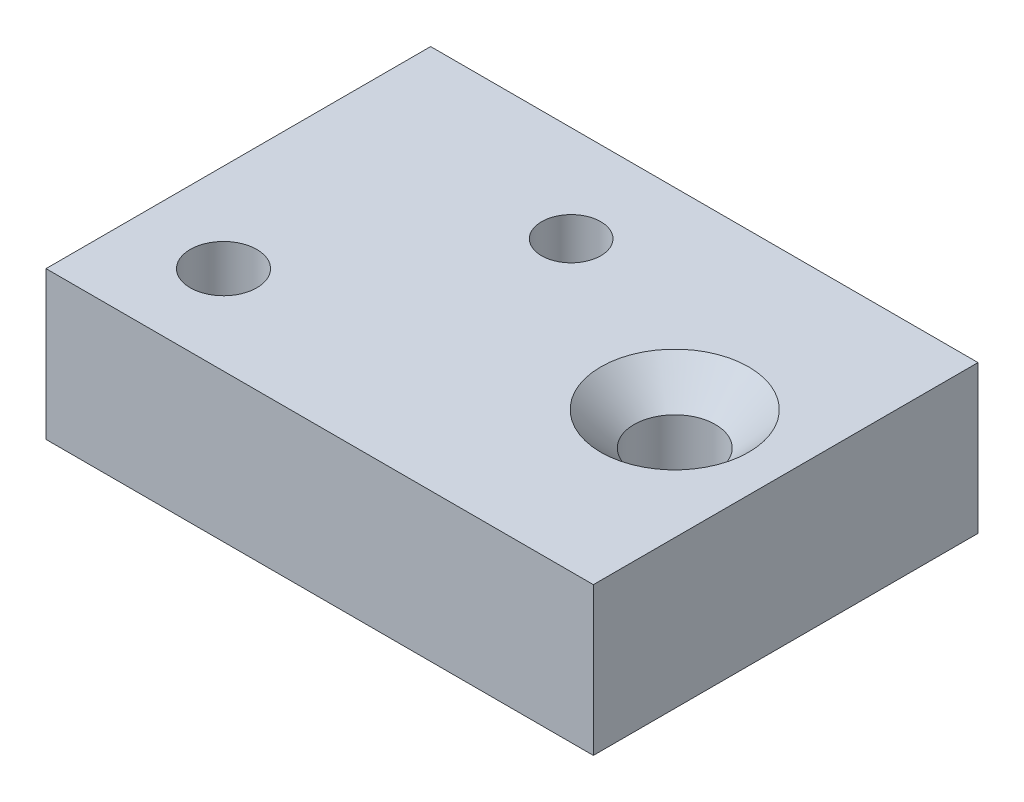
ISO-10303-21;
HEADER;
FILE_DESCRIPTION(('STEP AP214'),'2;1');
FILE_NAME('part.step','',(''),(''),'','','');
FILE_SCHEMA(('AUTOMOTIVE_DESIGN { 1 0 10303 214 1 1 1 1 }'));
ENDSEC;
DATA;
#1=APPLICATION_CONTEXT('core data for automotive mechanical design processes');
#2=APPLICATION_PROTOCOL_DEFINITION('international standard','automotive_design',2000,#1);
#3=PRODUCT_CONTEXT('',#1,'mechanical');
#4=PRODUCT('Part','Part','',(#3));
#5=PRODUCT_RELATED_PRODUCT_CATEGORY('part','',(#4));
#6=PRODUCT_DEFINITION_FORMATION('','',#4);
#7=PRODUCT_DEFINITION_CONTEXT('part definition',#1,'design');
#8=PRODUCT_DEFINITION('design','',#6,#7);
#9=PRODUCT_DEFINITION_SHAPE('','',#8);
#10=(LENGTH_UNIT() NAMED_UNIT(*) SI_UNIT(.MILLI.,.METRE.));
#11=(NAMED_UNIT(*) PLANE_ANGLE_UNIT() SI_UNIT($,.RADIAN.));
#12=(NAMED_UNIT(*) SI_UNIT($,.STERADIAN.) SOLID_ANGLE_UNIT());
#13=UNCERTAINTY_MEASURE_WITH_UNIT(LENGTH_MEASURE(1.E-05),#10,'distance_accuracy_value','');
#14=(GEOMETRIC_REPRESENTATION_CONTEXT(3) GLOBAL_UNCERTAINTY_ASSIGNED_CONTEXT((#13)) GLOBAL_UNIT_ASSIGNED_CONTEXT((#10,
#11,#12)) REPRESENTATION_CONTEXT('',''));
#15=CARTESIAN_POINT('',(0.,0.,0.));
#16=DIRECTION('',(0.,0.,1.));
#17=DIRECTION('',(1.,0.,0.));
#18=AXIS2_PLACEMENT_3D('',#15,#16,#17);
#19=CARTESIAN_POINT('',(0.,20.,-13.));
#20=DIRECTION('',(0.,1.,0.));
#21=DIRECTION('',(0.,0.,1.));
#22=AXIS2_PLACEMENT_3D('',#19,#20,#21);
#23=CYLINDRICAL_SURFACE('',#22,3.99999999999999);
#24=CARTESIAN_POINT('',(0.,0.,-13.));
#25=DIRECTION('',(0.,1.,0.));
#26=DIRECTION('',(0.,0.,1.));
#27=AXIS2_PLACEMENT_3D('',#24,#25,#26);
#28=CIRCLE('',#27,4.);
#29=CARTESIAN_POINT('',(0.,0.,-9.));
#30=VERTEX_POINT('',#29);
#31=EDGE_CURVE('E159',#30,#30,#28,.T.);
#32=ORIENTED_EDGE('',*,*,#31,.F.);
#33=EDGE_LOOP('',(#32));
#34=FACE_BOUND('',#33,.T.);
#35=CARTESIAN_POINT('',(0.,7.,-13.));
#36=DIRECTION('',(0.,1.,0.));
#37=DIRECTION('',(0.,0.,1.));
#38=AXIS2_PLACEMENT_3D('',#35,#36,#37);
#39=CIRCLE('',#38,3.99999999999999);
#40=CARTESIAN_POINT('',(0.,7.,-9.00000000000001));
#41=VERTEX_POINT('',#40);
#42=EDGE_CURVE('E40',#41,#41,#39,.F.);
#43=ORIENTED_EDGE('',*,*,#42,.F.);
#44=EDGE_LOOP('',(#43));
#45=FACE_BOUND('',#44,.T.);
#46=ADVANCED_FACE('F36',(#34,#45),#23,.F.);
#47=CARTESIAN_POINT('',(42.,0.,-26.));
#48=DIRECTION('',(0.,-1.,0.));
#49=DIRECTION('',(0.,0.,-1.));
#50=AXIS2_PLACEMENT_3D('',#47,#48,#49);
#51=PLANE('',#50);
#52=CARTESIAN_POINT('',(-20.,0.,14.));
#53=DIRECTION('',(0.,-1.,0.));
#54=DIRECTION('',(0.,0.,-1.));
#55=AXIS2_PLACEMENT_3D('',#52,#53,#54);
#56=CIRCLE('',#55,7.5);
#57=CARTESIAN_POINT('',(-20.,0.,6.5));
#58=VERTEX_POINT('',#57);
#59=EDGE_CURVE('E133',#58,#58,#56,.T.);
#60=ORIENTED_EDGE('',*,*,#59,.F.);
#61=EDGE_LOOP('',(#60));
#62=FACE_BOUND('',#61,.T.);
#63=CARTESIAN_POINT('',(27.,0.,0.));
#64=DIRECTION('',(0.,1.,0.));
#65=DIRECTION('',(0.,0.,1.));
#66=AXIS2_PLACEMENT_3D('',#63,#64,#65);
#67=CIRCLE('',#66,5.49999999999999);
#68=CARTESIAN_POINT('',(27.,0.,5.49999999999999));
#69=VERTEX_POINT('',#68);
#70=EDGE_CURVE('E167',#69,#69,#67,.T.);
#71=ORIENTED_EDGE('',*,*,#70,.T.);
#72=EDGE_LOOP('',(#71));
#73=FACE_BOUND('',#72,.T.);
#74=DIRECTION('',(0.,0.,-1.));
#75=VECTOR('',#74,1.);
#76=CARTESIAN_POINT('',(42.,0.,26.));
#77=LINE('',#76,#75);
#78=CARTESIAN_POINT('',(42.,0.,26.));
#79=VERTEX_POINT('',#78);
#80=CARTESIAN_POINT('',(42.,0.,-26.));
#81=VERTEX_POINT('',#80);
#82=EDGE_CURVE('E109',#79,#81,#77,.T.);
#83=ORIENTED_EDGE('',*,*,#82,.F.);
#84=DIRECTION('',(1.,0.,0.));
#85=VECTOR('',#84,1.);
#86=CARTESIAN_POINT('',(-32.,0.,26.));
#87=LINE('',#86,#85);
#88=CARTESIAN_POINT('',(-32.,0.,26.));
#89=VERTEX_POINT('',#88);
#90=EDGE_CURVE('E79',#89,#79,#87,.T.);
#91=ORIENTED_EDGE('',*,*,#90,.F.);
#92=DIRECTION('',(0.,0.,1.));
#93=VECTOR('',#92,1.);
#94=CARTESIAN_POINT('',(-32.,0.,26.));
#95=LINE('',#94,#93);
#96=CARTESIAN_POINT('',(-32.,0.,-26.));
#97=VERTEX_POINT('',#96);
#98=EDGE_CURVE('E73',#97,#89,#95,.T.);
#99=ORIENTED_EDGE('',*,*,#98,.F.);
#100=DIRECTION('',(-1.,0.,0.));
#101=VECTOR('',#100,1.);
#102=CARTESIAN_POINT('',(-32.,0.,-26.));
#103=LINE('',#102,#101);
#104=EDGE_CURVE('E96',#81,#97,#103,.T.);
#105=ORIENTED_EDGE('',*,*,#104,.F.);
#106=EDGE_LOOP('',(#83,#91,#99,#105));
#107=FACE_BOUND('',#106,.T.);
#108=ORIENTED_EDGE('',*,*,#31,.T.);
#109=EDGE_LOOP('',(#108));
#110=FACE_BOUND('',#109,.T.);
#111=ADVANCED_FACE('F213',(#62,#73,#107,#110),#51,.T.);
#112=CARTESIAN_POINT('',(42.,20.,26.));
#113=DIRECTION('',(-1.,0.,0.));
#114=DIRECTION('',(0.,0.,1.));
#115=AXIS2_PLACEMENT_3D('',#112,#113,#114);
#116=PLANE('',#115);
#117=ORIENTED_EDGE('',*,*,#82,.T.);
#118=DIRECTION('',(0.,-1.,0.));
#119=VECTOR('',#118,1.);
#120=CARTESIAN_POINT('',(42.,20.,-26.));
#121=LINE('',#120,#119);
#122=CARTESIAN_POINT('',(42.,20.,-26.));
#123=VERTEX_POINT('',#122);
#124=EDGE_CURVE('E11',#123,#81,#121,.T.);
#125=ORIENTED_EDGE('',*,*,#124,.F.);
#126=DIRECTION('',(0.,0.,-1.));
#127=VECTOR('',#126,1.);
#128=CARTESIAN_POINT('',(42.,20.,26.));
#129=LINE('',#128,#127);
#130=CARTESIAN_POINT('',(42.,20.,26.));
#131=VERTEX_POINT('',#130);
#132=EDGE_CURVE('E91',#131,#123,#129,.T.);
#133=ORIENTED_EDGE('',*,*,#132,.F.);
#134=DIRECTION('',(0.,-1.,0.));
#135=VECTOR('',#134,1.);
#136=CARTESIAN_POINT('',(42.,20.,26.));
#137=LINE('',#136,#135);
#138=EDGE_CURVE('E105',#131,#79,#137,.T.);
#139=ORIENTED_EDGE('',*,*,#138,.T.);
#140=EDGE_LOOP('',(#117,#125,#133,#139));
#141=FACE_BOUND('',#140,.T.);
#142=ADVANCED_FACE('F38',(#141),#116,.F.);
#143=CARTESIAN_POINT('',(-32.,20.,-26.));
#144=DIRECTION('',(0.,0.,1.));
#145=DIRECTION('',(1.,0.,0.));
#146=AXIS2_PLACEMENT_3D('',#143,#144,#145);
#147=PLANE('',#146);
#148=ORIENTED_EDGE('',*,*,#104,.T.);
#149=DIRECTION('',(0.,-1.,0.));
#150=VECTOR('',#149,1.);
#151=CARTESIAN_POINT('',(-32.,20.,-26.));
#152=LINE('',#151,#150);
#153=CARTESIAN_POINT('',(-32.,20.,-26.));
#154=VERTEX_POINT('',#153);
#155=EDGE_CURVE('E47',#154,#97,#152,.T.);
#156=ORIENTED_EDGE('',*,*,#155,.F.);
#157=DIRECTION('',(-1.,0.,0.));
#158=VECTOR('',#157,1.);
#159=CARTESIAN_POINT('',(-32.,20.,-26.));
#160=LINE('',#159,#158);
#161=EDGE_CURVE('E86',#123,#154,#160,.T.);
#162=ORIENTED_EDGE('',*,*,#161,.F.);
#163=ORIENTED_EDGE('',*,*,#124,.T.);
#164=EDGE_LOOP('',(#148,#156,#162,#163));
#165=FACE_BOUND('',#164,.T.);
#166=ADVANCED_FACE('F95',(#165),#147,.F.);
#167=CARTESIAN_POINT('',(-32.,20.,26.));
#168=DIRECTION('',(1.,0.,0.));
#169=DIRECTION('',(0.,0.,-1.));
#170=AXIS2_PLACEMENT_3D('',#167,#168,#169);
#171=PLANE('',#170);
#172=ORIENTED_EDGE('',*,*,#98,.T.);
#173=DIRECTION('',(0.,-1.,0.));
#174=VECTOR('',#173,1.);
#175=CARTESIAN_POINT('',(-32.,20.,26.));
#176=LINE('',#175,#174);
#177=CARTESIAN_POINT('',(-32.,20.,26.));
#178=VERTEX_POINT('',#177);
#179=EDGE_CURVE('E98',#178,#89,#176,.T.);
#180=ORIENTED_EDGE('',*,*,#179,.F.);
#181=DIRECTION('',(0.,0.,1.));
#182=VECTOR('',#181,1.);
#183=CARTESIAN_POINT('',(-32.,20.,26.));
#184=LINE('',#183,#182);
#185=EDGE_CURVE('E89',#154,#178,#184,.T.);
#186=ORIENTED_EDGE('',*,*,#185,.F.);
#187=ORIENTED_EDGE('',*,*,#155,.T.);
#188=EDGE_LOOP('',(#172,#180,#186,#187));
#189=FACE_BOUND('',#188,.T.);
#190=ADVANCED_FACE('F100',(#189),#171,.F.);
#191=CARTESIAN_POINT('',(-32.,20.,26.));
#192=DIRECTION('',(0.,0.,-1.));
#193=DIRECTION('',(-1.,0.,0.));
#194=AXIS2_PLACEMENT_3D('',#191,#192,#193);
#195=PLANE('',#194);
#196=ORIENTED_EDGE('',*,*,#90,.T.);
#197=ORIENTED_EDGE('',*,*,#138,.F.);
#198=DIRECTION('',(1.,0.,0.));
#199=VECTOR('',#198,1.);
#200=CARTESIAN_POINT('',(-32.,20.,26.));
#201=LINE('',#200,#199);
#202=EDGE_CURVE('E56',#178,#131,#201,.T.);
#203=ORIENTED_EDGE('',*,*,#202,.F.);
#204=ORIENTED_EDGE('',*,*,#179,.T.);
#205=EDGE_LOOP('',(#196,#197,#203,#204));
#206=FACE_BOUND('',#205,.T.);
#207=ADVANCED_FACE('F199',(#206),#195,.F.);
#208=CARTESIAN_POINT('',(42.,20.,-26.));
#209=DIRECTION('',(0.,-1.,0.));
#210=DIRECTION('',(0.,0.,-1.));
#211=AXIS2_PLACEMENT_3D('',#208,#209,#210);
#212=PLANE('',#211);
#213=CARTESIAN_POINT('',(-20.,20.,14.));
#214=DIRECTION('',(0.,-1.,0.));
#215=DIRECTION('',(0.,0.,-1.));
#216=AXIS2_PLACEMENT_3D('',#213,#214,#215);
#217=CIRCLE('',#216,4.5);
#218=CARTESIAN_POINT('',(-20.,20.,9.5));
#219=VERTEX_POINT('',#218);
#220=EDGE_CURVE('E155',#219,#219,#217,.T.);
#221=ORIENTED_EDGE('',*,*,#220,.T.);
#222=EDGE_LOOP('',(#221));
#223=FACE_BOUND('',#222,.T.);
#224=CARTESIAN_POINT('',(0.,20.,-13.));
#225=DIRECTION('',(0.,1.,0.));
#226=DIRECTION('',(0.,0.,1.));
#227=AXIS2_PLACEMENT_3D('',#224,#225,#226);
#228=CIRCLE('',#227,3.99999999999999);
#229=CARTESIAN_POINT('',(0.,20.,-9.00000000000001));
#230=VERTEX_POINT('',#229);
#231=EDGE_CURVE('E163',#230,#230,#228,.T.);
#232=ORIENTED_EDGE('',*,*,#231,.F.);
#233=EDGE_LOOP('',(#232));
#234=FACE_BOUND('',#233,.T.);
#235=CARTESIAN_POINT('',(27.,20.,0.));
#236=DIRECTION('',(0.,1.,0.));
#237=DIRECTION('',(0.,0.,1.));
#238=AXIS2_PLACEMENT_3D('',#235,#236,#237);
#239=CIRCLE('',#238,10.);
#240=CARTESIAN_POINT('',(27.,20.,10.));
#241=VERTEX_POINT('',#240);
#242=EDGE_CURVE('E113',#241,#241,#239,.T.);
#243=ORIENTED_EDGE('',*,*,#242,.F.);
#244=EDGE_LOOP('',(#243));
#245=FACE_BOUND('',#244,.T.);
#246=ORIENTED_EDGE('',*,*,#132,.T.);
#247=ORIENTED_EDGE('',*,*,#161,.T.);
#248=ORIENTED_EDGE('',*,*,#185,.T.);
#249=ORIENTED_EDGE('',*,*,#202,.T.);
#250=EDGE_LOOP('',(#246,#247,#248,#249));
#251=FACE_BOUND('',#250,.T.);
#252=ADVANCED_FACE('F87',(#223,#234,#245,#251),#212,.F.);
#253=CARTESIAN_POINT('',(27.,20.,0.));
#254=DIRECTION('',(0.,1.,0.));
#255=DIRECTION('',(0.,0.,1.));
#256=AXIS2_PLACEMENT_3D('',#253,#254,#255);
#257=CONICAL_SURFACE('',#256,10.,0.785398163397449);
#258=CARTESIAN_POINT('',(27.,15.5,0.));
#259=DIRECTION('',(0.,1.,0.));
#260=DIRECTION('',(0.,0.,1.));
#261=AXIS2_PLACEMENT_3D('',#258,#259,#260);
#262=CIRCLE('',#261,5.49999999999999);
#263=CARTESIAN_POINT('',(27.,15.5,5.49999999999999));
#264=VERTEX_POINT('',#263);
#265=EDGE_CURVE('E171',#264,#264,#262,.T.);
#266=ORIENTED_EDGE('',*,*,#265,.F.);
#267=EDGE_LOOP('',(#266));
#268=FACE_BOUND('',#267,.T.);
#269=ORIENTED_EDGE('',*,*,#242,.T.);
#270=EDGE_LOOP('',(#269));
#271=FACE_BOUND('',#270,.T.);
#272=ADVANCED_FACE('F196',(#268,#271),#257,.F.);
#273=CARTESIAN_POINT('',(27.,20.,0.));
#274=DIRECTION('',(0.,1.,0.));
#275=DIRECTION('',(0.,0.,1.));
#276=AXIS2_PLACEMENT_3D('',#273,#274,#275);
#277=CYLINDRICAL_SURFACE('',#276,5.49999999999999);
#278=ORIENTED_EDGE('',*,*,#70,.F.);
#279=EDGE_LOOP('',(#278));
#280=FACE_BOUND('',#279,.T.);
#281=ORIENTED_EDGE('',*,*,#265,.T.);
#282=EDGE_LOOP('',(#281));
#283=FACE_BOUND('',#282,.T.);
#284=ADVANCED_FACE('F206',(#280,#283),#277,.F.);
#285=CARTESIAN_POINT('',(0.,13.,-13.));
#286=DIRECTION('',(0.,1.,0.));
#287=DIRECTION('',(0.,0.,1.));
#288=AXIS2_PLACEMENT_3D('',#285,#286,#287);
#289=CIRCLE('',#288,3.99999999999999);
#290=CARTESIAN_POINT('',(0.,13.,-9.00000000000001));
#291=VERTEX_POINT('',#290);
#292=EDGE_CURVE('E123',#291,#291,#289,.F.);
#293=ORIENTED_EDGE('',*,*,#292,.T.);
#294=EDGE_LOOP('',(#293));
#295=FACE_BOUND('',#294,.T.);
#296=ORIENTED_EDGE('',*,*,#231,.T.);
#297=EDGE_LOOP('',(#296));
#298=FACE_BOUND('',#297,.T.);
#299=ADVANCED_FACE('F216',(#295,#298),#23,.F.);
#300=CARTESIAN_POINT('',(-20.,0.,14.));
#301=DIRECTION('',(0.,-1.,0.));
#302=DIRECTION('',(0.,0.,-1.));
#303=AXIS2_PLACEMENT_3D('',#300,#301,#302);
#304=CYLINDRICAL_SURFACE('',#303,4.5);
#305=ORIENTED_EDGE('',*,*,#220,.F.);
#306=EDGE_LOOP('',(#305));
#307=FACE_BOUND('',#306,.T.);
#308=CARTESIAN_POINT('',(-20.,8.,14.));
#309=DIRECTION('',(0.,-1.,0.));
#310=DIRECTION('',(0.,0.,-1.));
#311=AXIS2_PLACEMENT_3D('',#308,#309,#310);
#312=CIRCLE('',#311,4.50000000000001);
#313=CARTESIAN_POINT('',(-20.,8.,9.49999999999999));
#314=VERTEX_POINT('',#313);
#315=EDGE_CURVE('E151',#314,#314,#312,.T.);
#316=ORIENTED_EDGE('',*,*,#315,.T.);
#317=EDGE_LOOP('',(#316));
#318=FACE_BOUND('',#317,.T.);
#319=ADVANCED_FACE('F226',(#307,#318),#304,.F.);
#320=CARTESIAN_POINT('',(-15.5,8.,14.));
#321=DIRECTION('',(0.,1.,0.));
#322=DIRECTION('',(0.,0.,1.));
#323=AXIS2_PLACEMENT_3D('',#320,#321,#322);
#324=PLANE('',#323);
#325=ORIENTED_EDGE('',*,*,#315,.F.);
#326=EDGE_LOOP('',(#325));
#327=FACE_BOUND('',#326,.T.);
#328=CARTESIAN_POINT('',(-20.,8.,14.));
#329=DIRECTION('',(0.,-1.,0.));
#330=DIRECTION('',(0.,0.,-1.));
#331=AXIS2_PLACEMENT_3D('',#328,#329,#330);
#332=CIRCLE('',#331,7.5);
#333=CARTESIAN_POINT('',(-20.,8.,6.5));
#334=VERTEX_POINT('',#333);
#335=EDGE_CURVE('E147',#334,#334,#332,.T.);
#336=ORIENTED_EDGE('',*,*,#335,.T.);
#337=EDGE_LOOP('',(#336));
#338=FACE_BOUND('',#337,.T.);
#339=ADVANCED_FACE('F231',(#327,#338),#324,.F.);
#340=CARTESIAN_POINT('',(-20.,0.,14.));
#341=DIRECTION('',(0.,-1.,0.));
#342=DIRECTION('',(0.,0.,-1.));
#343=AXIS2_PLACEMENT_3D('',#340,#341,#342);
#344=CYLINDRICAL_SURFACE('',#343,7.5);
#345=ORIENTED_EDGE('',*,*,#335,.F.);
#346=EDGE_LOOP('',(#345));
#347=FACE_BOUND('',#346,.T.);
#348=ORIENTED_EDGE('',*,*,#59,.T.);
#349=EDGE_LOOP('',(#348));
#350=FACE_BOUND('',#349,.T.);
#351=ADVANCED_FACE('F296',(#347,#350),#344,.F.);
#352=CARTESIAN_POINT('',(0.,7.,-13.));
#353=DIRECTION('',(0.,1.,0.));
#354=DIRECTION('',(0.,0.,1.));
#355=AXIS2_PLACEMENT_3D('',#352,#353,#354);
#356=PLANE('',#355);
#357=CARTESIAN_POINT('',(0.,7.,-13.));
#358=DIRECTION('',(0.,1.,0.));
#359=DIRECTION('',(0.,0.,1.));
#360=AXIS2_PLACEMENT_3D('',#357,#358,#359);
#361=CIRCLE('',#360,8.);
#362=CARTESIAN_POINT('',(0.,7.,-5.));
#363=VERTEX_POINT('',#362);
#364=EDGE_CURVE('E126',#363,#363,#361,.T.);
#365=ORIENTED_EDGE('',*,*,#364,.T.);
#366=EDGE_LOOP('',(#365));
#367=FACE_BOUND('',#366,.T.);
#368=ORIENTED_EDGE('',*,*,#42,.T.);
#369=EDGE_LOOP('',(#368));
#370=FACE_BOUND('',#369,.T.);
#371=ADVANCED_FACE('F306',(#367,#370),#356,.T.);
#372=CARTESIAN_POINT('',(0.,13.,-13.));
#373=DIRECTION('',(0.,1.,0.));
#374=DIRECTION('',(0.,0.,1.));
#375=AXIS2_PLACEMENT_3D('',#372,#373,#374);
#376=PLANE('',#375);
#377=CARTESIAN_POINT('',(0.,13.,-13.));
#378=DIRECTION('',(0.,1.,0.));
#379=DIRECTION('',(0.,0.,1.));
#380=AXIS2_PLACEMENT_3D('',#377,#378,#379);
#381=CIRCLE('',#380,8.);
#382=CARTESIAN_POINT('',(0.,13.,-5.));
#383=VERTEX_POINT('',#382);
#384=EDGE_CURVE('E135',#383,#383,#381,.T.);
#385=ORIENTED_EDGE('',*,*,#384,.F.);
#386=EDGE_LOOP('',(#385));
#387=FACE_BOUND('',#386,.T.);
#388=ORIENTED_EDGE('',*,*,#292,.F.);
#389=EDGE_LOOP('',(#388));
#390=FACE_BOUND('',#389,.T.);
#391=ADVANCED_FACE('F315',(#387,#390),#376,.F.);
#392=CARTESIAN_POINT('',(0.,7.,-13.));
#393=DIRECTION('',(0.,1.,0.));
#394=DIRECTION('',(0.,0.,1.));
#395=AXIS2_PLACEMENT_3D('',#392,#393,#394);
#396=CYLINDRICAL_SURFACE('',#395,8.);
#397=ORIENTED_EDGE('',*,*,#364,.F.);
#398=EDGE_LOOP('',(#397));
#399=FACE_BOUND('',#398,.T.);
#400=ORIENTED_EDGE('',*,*,#384,.T.);
#401=EDGE_LOOP('',(#400));
#402=FACE_BOUND('',#401,.T.);
#403=ADVANCED_FACE('F324',(#399,#402),#396,.F.);
#404=CLOSED_SHELL('',(#46,#111,#142,#166,#190,#207,#252,#272,#284,#299,#319,#339,#351,#371,#391,#403));
#405=MANIFOLD_SOLID_BREP('B2',#404);
#406=ADVANCED_BREP_SHAPE_REPRESENTATION('',(#18,#405),#14);
#407=SHAPE_DEFINITION_REPRESENTATION(#9,#406);
ENDSEC;
END-ISO-10303-21;
